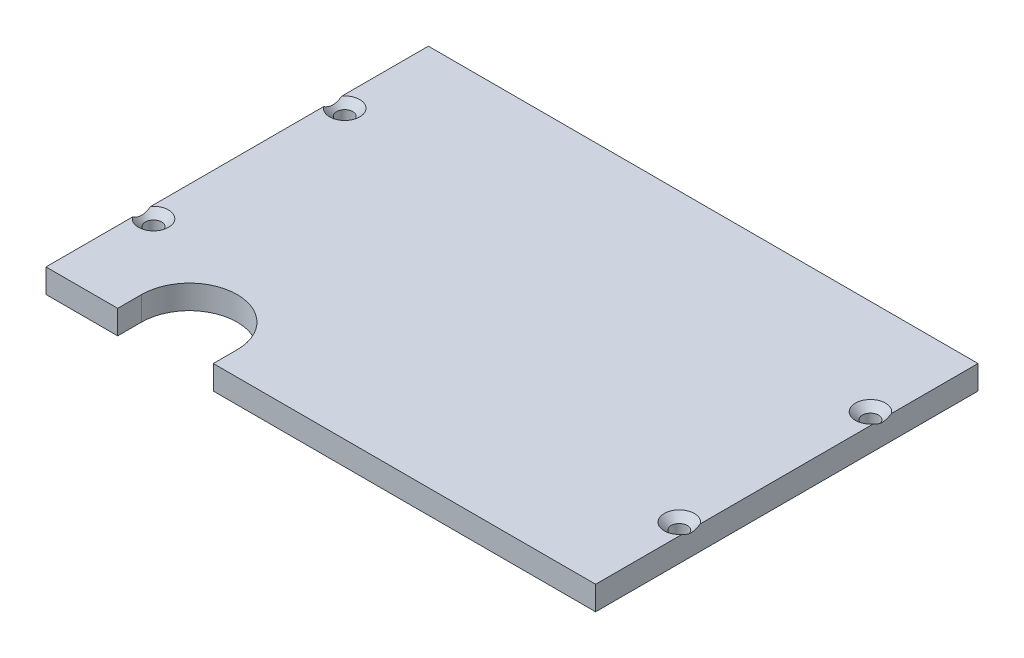
ISO-10303-21;
HEADER;
FILE_DESCRIPTION(('STEP AP214'),'2;1');
FILE_NAME('part.step','',(''),(''),'','','');
FILE_SCHEMA(('AUTOMOTIVE_DESIGN { 1 0 10303 214 1 1 1 1 }'));
ENDSEC;
DATA;
#1=APPLICATION_CONTEXT('core data for automotive mechanical design processes');
#2=APPLICATION_PROTOCOL_DEFINITION('international standard','automotive_design',2000,#1);
#3=PRODUCT_CONTEXT('',#1,'mechanical');
#4=PRODUCT('Part','Part','',(#3));
#5=PRODUCT_RELATED_PRODUCT_CATEGORY('part','',(#4));
#6=PRODUCT_DEFINITION_FORMATION('','',#4);
#7=PRODUCT_DEFINITION_CONTEXT('part definition',#1,'design');
#8=PRODUCT_DEFINITION('design','',#6,#7);
#9=PRODUCT_DEFINITION_SHAPE('','',#8);
#10=(LENGTH_UNIT() NAMED_UNIT(*) SI_UNIT(.MILLI.,.METRE.));
#11=(NAMED_UNIT(*) PLANE_ANGLE_UNIT() SI_UNIT($,.RADIAN.));
#12=(NAMED_UNIT(*) SI_UNIT($,.STERADIAN.) SOLID_ANGLE_UNIT());
#13=UNCERTAINTY_MEASURE_WITH_UNIT(LENGTH_MEASURE(1.E-05),#10,'distance_accuracy_value','');
#14=(GEOMETRIC_REPRESENTATION_CONTEXT(3) GLOBAL_UNCERTAINTY_ASSIGNED_CONTEXT((#13)) GLOBAL_UNIT_ASSIGNED_CONTEXT((#10,
#11,#12)) REPRESENTATION_CONTEXT('',''));
#15=CARTESIAN_POINT('',(0.,0.,0.));
#16=DIRECTION('',(0.,0.,1.));
#17=DIRECTION('',(1.,0.,0.));
#18=AXIS2_PLACEMENT_3D('',#15,#16,#17);
#19=CARTESIAN_POINT('',(0.,-5.,0.));
#20=DIRECTION('',(-1.,0.,0.));
#21=DIRECTION('',(0.,0.,1.));
#22=AXIS2_PLACEMENT_3D('',#19,#20,#21);
#23=PLANE('',#22);
#24=CARTESIAN_POINT('',(0.,2.14470506738386,-64.6673227604892));
#25=CARTESIAN_POINT('',(0.,2.04804038573964,-64.5576455291573));
#26=CARTESIAN_POINT('',(0.,1.95178340767227,-64.4476051730159));
#27=CARTESIAN_POINT('',(0.,1.76030441078791,-64.2266038689229));
#28=CARTESIAN_POINT('',(0.,1.66508252459353,-64.1156428061426));
#29=CARTESIAN_POINT('',(0.,1.47542063978898,-63.8920472480246));
#30=CARTESIAN_POINT('',(0.,1.38098738325443,-63.7794070219388));
#31=CARTESIAN_POINT('',(0.,1.19375450781671,-63.5527852582765));
#32=CARTESIAN_POINT('',(0.,1.10095479472035,-63.4388037986748));
#33=CARTESIAN_POINT('',(0.,0.911300374975574,-63.2014980260879));
#34=CARTESIAN_POINT('',(0.,0.814589313210296,-63.0780585222355));
#35=CARTESIAN_POINT('',(0.,0.624318910573129,-62.8287765439328));
#36=CARTESIAN_POINT('',(0.,0.530759323056346,-62.7029342587456));
#37=CARTESIAN_POINT('',(0.,0.348128832657607,-62.4484184910059));
#38=CARTESIAN_POINT('',(0.,0.259048883672382,-62.3197515355747));
#39=CARTESIAN_POINT('',(0.,0.0869152469271358,-62.0584717595877));
#40=CARTESIAN_POINT('',(0.,0.00385889176521005,-61.9258607227125));
#41=CARTESIAN_POINT('',(0.,-0.128597655752122,-61.6983755764979));
#42=CARTESIAN_POINT('',(0.,-0.180321852516153,-61.6048617608502));
#43=CARTESIAN_POINT('',(0.,-0.278469932148575,-61.4150245683994));
#44=CARTESIAN_POINT('',(0.,-0.324892237393613,-61.3187003659903));
#45=CARTESIAN_POINT('',(0.,-0.410357261039289,-61.1239311978321));
#46=CARTESIAN_POINT('',(0.,-0.449468569164255,-61.0255167193119));
#47=CARTESIAN_POINT('',(0.,-0.518863822314614,-60.8256125361317));
#48=CARTESIAN_POINT('',(0.,-0.549153192881912,-60.724124764148));
#49=CARTESIAN_POINT('',(0.,-0.591533247046322,-60.5484150474986));
#50=CARTESIAN_POINT('',(0.,-0.606354808895325,-60.4748525283882));
#51=CARTESIAN_POINT('',(0.,-0.629797590769258,-60.3267412104027));
#52=CARTESIAN_POINT('',(0.,-0.63841994675027,-60.2521925947731));
#53=CARTESIAN_POINT('',(0.,-0.64899708857063,-60.1027552922653));
#54=CARTESIAN_POINT('',(0.,-0.650964113844461,-60.0278674835375));
#55=CARTESIAN_POINT('',(0.,-0.648153935760052,-59.8782161608349));
#56=CARTESIAN_POINT('',(0.,-0.643376365896324,-59.8034526538357));
#57=CARTESIAN_POINT('',(0.,-0.627381213292676,-59.6549945598021));
#58=CARTESIAN_POINT('',(0.,-0.616194857485032,-59.5812965534887));
#59=CARTESIAN_POINT('',(0.,-0.587961948728264,-59.4350277588885));
#60=CARTESIAN_POINT('',(0.,-0.570913863496585,-59.3624572705294));
#61=CARTESIAN_POINT('',(0.,-0.531614925585797,-59.2184912614131));
#62=CARTESIAN_POINT('',(0.,-0.509346653434911,-59.1471005505784));
#63=CARTESIAN_POINT('',(0.,-0.460406770150915,-59.0058670814294));
#64=CARTESIAN_POINT('',(0.,-0.433735413620173,-58.9360242338768));
#65=CARTESIAN_POINT('',(0.,-0.363010101352297,-58.7646866095353));
#66=CARTESIAN_POINT('',(0.,-0.316759942935124,-58.6641008743433));
#67=CARTESIAN_POINT('',(0.,-0.218125828273922,-58.4659614822295));
#68=CARTESIAN_POINT('',(0.,-0.165738206643062,-58.3684096816775));
#69=CARTESIAN_POINT('',(0.,-0.0561990245488804,-58.1757478680392));
#70=CARTESIAN_POINT('',(0.,0.000963010001086409,-58.0806438558348));
#71=CARTESIAN_POINT('',(0.,0.118841814640728,-57.8927081599856));
#72=CARTESIAN_POINT('',(0.,0.179557858404495,-57.7998760175047));
#73=CARTESIAN_POINT('',(0.,0.304648390446216,-57.6147717264333));
#74=CARTESIAN_POINT('',(0.,0.369062876231045,-57.5225267327214));
#75=CARTESIAN_POINT('',(0.,0.500129477280067,-57.3396411366363));
#76=CARTESIAN_POINT('',(0.,0.566781680204431,-57.2490005973287));
#77=CARTESIAN_POINT('',(0.,0.701771577343232,-57.0691864511182));
#78=CARTESIAN_POINT('',(0.,0.770106766972496,-56.9800109589332));
#79=CARTESIAN_POINT('',(0.,0.908213690897816,-56.8027873124904));
#80=CARTESIAN_POINT('',(0.,0.977985374060587,-56.7147391182858));
#81=CARTESIAN_POINT('',(0.,1.21671326046477,-56.4175603724222));
#82=CARTESIAN_POINT('',(0.,1.3884236269837,-56.2106431555064));
#83=CARTESIAN_POINT('',(0.,1.73615145442411,-55.8004510705346));
#84=CARTESIAN_POINT('',(0.,1.91216942278523,-55.5971766365353));
#85=CARTESIAN_POINT('',(0.,2.26722514821177,-55.193170244573));
#86=CARTESIAN_POINT('',(0.,2.44626386779753,-54.9924391340919));
#87=CARTESIAN_POINT('',(0.,2.80646061614009,-54.5928864589446));
#88=CARTESIAN_POINT('',(0.,2.98761868106823,-54.3940649269755));
#89=CARTESIAN_POINT('',(0.,3.35181816484024,-53.9975172743651));
#90=CARTESIAN_POINT('',(0.,3.53486231447149,-53.7997936648681));
#91=CARTESIAN_POINT('',(0.,3.90215008698826,-53.4054609403436));
#92=CARTESIAN_POINT('',(0.,4.08639372301235,-53.2088518375682));
#93=CARTESIAN_POINT('',(0.,4.64042891389233,-52.620407032647));
#94=CARTESIAN_POINT('',(0.,5.01160082687711,-52.229871498623));
#95=CARTESIAN_POINT('',(0.,5.71402805252223,-51.4952324026565));
#96=CARTESIAN_POINT('',(0.,6.04503321308733,-51.1508889854455));
#97=CARTESIAN_POINT('',(0.,6.70837915693934,-50.4634502173727));
#98=CARTESIAN_POINT('',(0.,7.04072002146205,-50.1203549449151));
#99=CARTESIAN_POINT('',(0.,7.70542483235975,-49.4360589415294));
#100=CARTESIAN_POINT('',(0.,8.03778608943345,-49.0948555960584));
#101=CARTESIAN_POINT('',(0.,8.70322099771822,-48.4131901175498));
#102=CARTESIAN_POINT('',(0.,9.03629459818936,-48.0727279349908));
#103=CARTESIAN_POINT('',(0.,9.3696270386106,-47.7325201778886));
#104=B_SPLINE_CURVE_WITH_KNOTS('',3,(#24,#25,#26,#27,#28,#29,#30,#31,#32,#33,#34,#35,#36,#37,
#38,#39,#40,#41,#42,#43,#44,#45,#46,#47,#48,#49,#50,#51,#52,#53,#54,#55,#56,#57,#58,#59,#60,#61,
#62,#63,#64,#65,#66,#67,#68,#69,#70,#71,#72,#73,#74,#75,#76,#77,#78,#79,#80,#81,#82,#83,#84,#85,
#86,#87,#88,#89,#90,#91,#92,#93,#94,#95,#96,#97,#98,#99,#100,#101,#102,#103),.UNSPECIFIED.,.F.,
.F.,(4,2,2,2,2,2,2,2,2,2,2,2,2,2,2,2,2,2,2,2,2,2,2,2,2,2,2,2,2,2,2,2,2,2,2,2,2,2,2,4),(0.,
0.438590046589923,0.877235641036946,1.31818722879923,1.75911330661538,2.22951563461658,
2.69988106141641,3.16925499196792,3.63841978626333,3.95889023477053,4.27945579492674,
4.59684370347591,4.91403600247658,5.13892838196225,5.36377954116467,5.58821696416134,
5.81266658369639,6.0360317580985,6.25945536561297,6.48363541332445,6.70780250266699,
7.03963419919012,7.37166509071615,7.7044445503452,8.03715623633875,8.37464261768403,
8.71214223515848,9.04916678328737,9.38617935539358,10.1927264699041,10.9993690581913,
11.806273716728,12.613192167031,13.4215160892333,14.2298488803591,15.846178176558,
17.2790848381215,18.7120800073948,20.1410482748921,21.5699179391234),.UNSPECIFIED.);
#105=CARTESIAN_POINT('',(0.,0.,-61.9163767896737));
#106=VERTEX_POINT('',#105);
#107=CARTESIAN_POINT('',(0.,0.,-58.0836232103263));
#108=VERTEX_POINT('',#107);
#109=EDGE_CURVE('E11',#106,#108,#104,.T.);
#110=ORIENTED_EDGE('',*,*,#109,.F.);
#111=DIRECTION('',(0.,0.,1.));
#112=VECTOR('',#111,1.);
#113=CARTESIAN_POINT('',(0.,0.,0.));
#114=LINE('',#113,#112);
#115=CARTESIAN_POINT('',(0.,0.,-80.));
#116=VERTEX_POINT('',#115);
#117=EDGE_CURVE('E139',#116,#106,#114,.T.);
#118=ORIENTED_EDGE('',*,*,#117,.F.);
#119=DIRECTION('',(0.,1.,0.));
#120=VECTOR('',#119,1.);
#121=CARTESIAN_POINT('',(0.,-5.,-80.));
#122=LINE('',#121,#120);
#123=CARTESIAN_POINT('',(0.,-5.,-80.));
#124=VERTEX_POINT('',#123);
#125=EDGE_CURVE('E187',#124,#116,#122,.T.);
#126=ORIENTED_EDGE('',*,*,#125,.F.);
#127=DIRECTION('',(0.,0.,1.));
#128=VECTOR('',#127,1.);
#129=CARTESIAN_POINT('',(0.,-5.,0.));
#130=LINE('',#129,#128);
#131=CARTESIAN_POINT('',(0.,-5.,0.));
#132=VERTEX_POINT('',#131);
#133=EDGE_CURVE('E186',#124,#132,#130,.T.);
#134=ORIENTED_EDGE('',*,*,#133,.T.);
#135=DIRECTION('',(0.,1.,0.));
#136=VECTOR('',#135,1.);
#137=CARTESIAN_POINT('',(0.,-5.,0.));
#138=LINE('',#137,#136);
#139=CARTESIAN_POINT('',(0.,0.,0.));
#140=VERTEX_POINT('',#139);
#141=EDGE_CURVE('E210',#132,#140,#138,.T.);
#142=ORIENTED_EDGE('',*,*,#141,.T.);
#143=CARTESIAN_POINT('',(0.,0.,-18.0836232103263));
#144=VERTEX_POINT('',#143);
#145=EDGE_CURVE('E146',#144,#140,#114,.T.);
#146=ORIENTED_EDGE('',*,*,#145,.F.);
#147=CARTESIAN_POINT('',(0.,2.14470506738386,-24.6673227604892));
#148=CARTESIAN_POINT('',(0.,2.04804038573963,-24.5576455291573));
#149=CARTESIAN_POINT('',(0.,1.95178340767226,-24.4476051730159));
#150=CARTESIAN_POINT('',(0.,1.76030441078791,-24.2266038689229));
#151=CARTESIAN_POINT('',(0.,1.66508252459353,-24.1156428061426));
#152=CARTESIAN_POINT('',(0.,1.47542063978898,-23.8920472480246));
#153=CARTESIAN_POINT('',(0.,1.38098738325442,-23.7794070219388));
#154=CARTESIAN_POINT('',(0.,1.19375450781671,-23.5527852582765));
#155=CARTESIAN_POINT('',(0.,1.10095479472035,-23.4388037986748));
#156=CARTESIAN_POINT('',(0.,0.911300374975571,-23.2014980260879));
#157=CARTESIAN_POINT('',(0.,0.814589313210293,-23.0780585222355));
#158=CARTESIAN_POINT('',(0.,0.624318910573126,-22.8287765439328));
#159=CARTESIAN_POINT('',(0.,0.530759323056341,-22.7029342587456));
#160=CARTESIAN_POINT('',(0.,0.348128832657599,-22.4484184910059));
#161=CARTESIAN_POINT('',(0.,0.259048883672373,-22.3197515355747));
#162=CARTESIAN_POINT('',(0.,0.08691524692713,-22.0584717595877));
#163=CARTESIAN_POINT('',(0.,0.00385889176520677,-21.9258607227125));
#164=CARTESIAN_POINT('',(0.,-0.128597655752126,-21.6983755764979));
#165=CARTESIAN_POINT('',(0.,-0.18032185251616,-21.6048617608502));
#166=CARTESIAN_POINT('',(0.,-0.278469932148583,-21.4150245683994));
#167=CARTESIAN_POINT('',(0.,-0.324892237393621,-21.3187003659903));
#168=CARTESIAN_POINT('',(0.,-0.410357261039295,-21.1239311978321));
#169=CARTESIAN_POINT('',(0.,-0.44946856916426,-21.0255167193119));
#170=CARTESIAN_POINT('',(0.,-0.518863822314618,-20.8256125361317));
#171=CARTESIAN_POINT('',(0.,-0.549153192881915,-20.724124764148));
#172=CARTESIAN_POINT('',(0.,-0.591533247046322,-20.5484150474986));
#173=CARTESIAN_POINT('',(0.,-0.606354808895325,-20.4748525283882));
#174=CARTESIAN_POINT('',(0.,-0.629797590769258,-20.3267412104027));
#175=CARTESIAN_POINT('',(0.,-0.63841994675027,-20.2521925947731));
#176=CARTESIAN_POINT('',(0.,-0.64899708857063,-20.1027552922653));
#177=CARTESIAN_POINT('',(0.,-0.650964113844462,-20.0278674835375));
#178=CARTESIAN_POINT('',(0.,-0.648153935760052,-19.8782161608349));
#179=CARTESIAN_POINT('',(0.,-0.643376365896324,-19.8034526538357));
#180=CARTESIAN_POINT('',(0.,-0.627381213292676,-19.6549945598021));
#181=CARTESIAN_POINT('',(0.,-0.616194857485033,-19.5812965534887));
#182=CARTESIAN_POINT('',(0.,-0.587961948728264,-19.4350277588885));
#183=CARTESIAN_POINT('',(0.,-0.570913863496584,-19.3624572705294));
#184=CARTESIAN_POINT('',(0.,-0.531614925585793,-19.2184912614131));
#185=CARTESIAN_POINT('',(0.,-0.509346653434907,-19.1471005505783));
#186=CARTESIAN_POINT('',(0.,-0.460406770150912,-19.0058670814294));
#187=CARTESIAN_POINT('',(0.,-0.433735413620169,-18.9360242338768));
#188=CARTESIAN_POINT('',(0.,-0.363010101352291,-18.7646866095353));
#189=CARTESIAN_POINT('',(0.,-0.316759942935113,-18.6641008743432));
#190=CARTESIAN_POINT('',(0.,-0.218125828273906,-18.4659614822295));
#191=CARTESIAN_POINT('',(0.,-0.165738206643045,-18.3684096816775));
#192=CARTESIAN_POINT('',(0.,-0.0561990245488614,-18.1757478680392));
#193=CARTESIAN_POINT('',(0.,0.00096301000110724,-18.0806438558347));
#194=CARTESIAN_POINT('',(0.,0.11884181464075,-17.8927081599856));
#195=CARTESIAN_POINT('',(0.,0.179557858404516,-17.7998760175046));
#196=CARTESIAN_POINT('',(0.,0.304648390446239,-17.6147717264333));
#197=CARTESIAN_POINT('',(0.,0.369062876231071,-17.5225267327214));
#198=CARTESIAN_POINT('',(0.,0.500129477280097,-17.3396411366362));
#199=CARTESIAN_POINT('',(0.,0.566781680204464,-17.2490005973286));
#200=CARTESIAN_POINT('',(0.,0.701771577343267,-17.0691864511181));
#201=CARTESIAN_POINT('',(0.,0.770106766972531,-16.9800109589331));
#202=CARTESIAN_POINT('',(0.,0.908213690897854,-16.8027873124904));
#203=CARTESIAN_POINT('',(0.,0.977985374060626,-16.7147391182857));
#204=CARTESIAN_POINT('',(0.,1.21671326046481,-16.4175603724221));
#205=CARTESIAN_POINT('',(0.,1.38842362698374,-16.2106431555064));
#206=CARTESIAN_POINT('',(0.,1.73615145442415,-15.8004510705345));
#207=CARTESIAN_POINT('',(0.,1.91216942278527,-15.5971766365353));
#208=CARTESIAN_POINT('',(0.,2.26722514821181,-15.193170244573));
#209=CARTESIAN_POINT('',(0.,2.44626386779757,-14.9924391340918));
#210=CARTESIAN_POINT('',(0.,2.80646061614013,-14.5928864589446));
#211=CARTESIAN_POINT('',(0.,2.98761868106826,-14.3940649269755));
#212=CARTESIAN_POINT('',(0.,3.35181816484027,-13.9975172743651));
#213=CARTESIAN_POINT('',(0.,3.53486231447153,-13.7997936648681));
#214=CARTESIAN_POINT('',(0.,3.9021500869883,-13.4054609403436));
#215=CARTESIAN_POINT('',(0.,4.08639372301239,-13.2088518375682));
#216=CARTESIAN_POINT('',(0.,4.64042891389237,-12.620407032647));
#217=CARTESIAN_POINT('',(0.,5.01160082687715,-12.2298714986229));
#218=CARTESIAN_POINT('',(0.,5.71402805252227,-11.4952324026565));
#219=CARTESIAN_POINT('',(0.,6.04503321308737,-11.1508889854455));
#220=CARTESIAN_POINT('',(0.,6.70837915693938,-10.4634502173726));
#221=CARTESIAN_POINT('',(0.,7.04072002146209,-10.1203549449151));
#222=CARTESIAN_POINT('',(0.,7.70542483235978,-9.43605894152936));
#223=CARTESIAN_POINT('',(0.,8.03778608943349,-9.0948555960584));
#224=CARTESIAN_POINT('',(0.,8.70322099771826,-8.41319011754976));
#225=CARTESIAN_POINT('',(0.,9.0362945981894,-8.07272793499074));
#226=CARTESIAN_POINT('',(0.,9.36962703861063,-7.73252017788857));
#227=B_SPLINE_CURVE_WITH_KNOTS('',3,(#147,#148,#149,#150,#151,#152,#153,#154,#155,#156,#157,
#158,#159,#160,#161,#162,#163,#164,#165,#166,#167,#168,#169,#170,#171,#172,#173,#174,#175,#176,
#177,#178,#179,#180,#181,#182,#183,#184,#185,#186,#187,#188,#189,#190,#191,#192,#193,#194,#195,
#196,#197,#198,#199,#200,#201,#202,#203,#204,#205,#206,#207,#208,#209,#210,#211,#212,#213,#214,
#215,#216,#217,#218,#219,#220,#221,#222,#223,#224,#225,#226),.UNSPECIFIED.,.F.,.F.,(4,2,2,2,2,2,
2,2,2,2,2,2,2,2,2,2,2,2,2,2,2,2,2,2,2,2,2,2,2,2,2,2,2,2,2,2,2,2,2,4),(0.,0.43859004658992,
0.877235641036942,1.31818722879922,1.75911330661537,2.22951563461657,2.69988106141641,
3.16925499196792,3.63841978626332,3.95889023477053,4.27945579492675,4.5968437034759,
4.91403600247657,5.13892838196224,5.36377954116465,5.58821696416133,5.81266658369638,
6.03603175809848,6.25945536561296,6.48363541332445,6.70780250266699,7.03963419919014,
7.37166509071618,7.70444455034523,8.03715623633878,8.37464261768407,8.71214223515852,
9.04916678328742,9.38617935539363,10.1927264699041,10.9993690581914,11.8062737167281,
12.613192167031,13.4215160892334,14.2298488803592,15.8461781765581,17.2790848381216,
18.7120800073948,20.1410482748922,21.5699179391234),.UNSPECIFIED.);
#228=CARTESIAN_POINT('',(0.,0.,-21.9163767896737));
#229=VERTEX_POINT('',#228);
#230=EDGE_CURVE('E54',#229,#144,#227,.T.);
#231=ORIENTED_EDGE('',*,*,#230,.F.);
#232=EDGE_CURVE('E66',#108,#229,#114,.T.);
#233=ORIENTED_EDGE('',*,*,#232,.F.);
#234=EDGE_LOOP('',(#110,#118,#126,#134,#142,#146,#231,#233));
#235=FACE_BOUND('',#234,.T.);
#236=ADVANCED_FACE('F40',(#235),#23,.T.);
#237=CARTESIAN_POINT('',(0.,-5.,-80.));
#238=DIRECTION('',(0.,0.,-1.));
#239=DIRECTION('',(-1.,0.,0.));
#240=AXIS2_PLACEMENT_3D('',#237,#238,#239);
#241=PLANE('',#240);
#242=DIRECTION('',(-1.,0.,0.));
#243=VECTOR('',#242,1.);
#244=CARTESIAN_POINT('',(0.,0.,-80.));
#245=LINE('',#244,#243);
#246=CARTESIAN_POINT('',(115.,0.,-80.));
#247=VERTEX_POINT('',#246);
#248=EDGE_CURVE('E182',#247,#116,#245,.T.);
#249=ORIENTED_EDGE('',*,*,#248,.F.);
#250=DIRECTION('',(0.,1.,0.));
#251=VECTOR('',#250,1.);
#252=CARTESIAN_POINT('',(115.,-5.,-80.));
#253=LINE('',#252,#251);
#254=CARTESIAN_POINT('',(115.,-5.,-80.));
#255=VERTEX_POINT('',#254);
#256=EDGE_CURVE('E191',#255,#247,#253,.T.);
#257=ORIENTED_EDGE('',*,*,#256,.F.);
#258=DIRECTION('',(-1.,0.,0.));
#259=VECTOR('',#258,1.);
#260=CARTESIAN_POINT('',(0.,-5.,-80.));
#261=LINE('',#260,#259);
#262=EDGE_CURVE('E156',#255,#124,#261,.T.);
#263=ORIENTED_EDGE('',*,*,#262,.T.);
#264=ORIENTED_EDGE('',*,*,#125,.T.);
#265=EDGE_LOOP('',(#249,#257,#263,#264));
#266=FACE_BOUND('',#265,.T.);
#267=ADVANCED_FACE('F238',(#266),#241,.T.);
#268=CARTESIAN_POINT('',(115.,-5.,0.));
#269=DIRECTION('',(1.,0.,0.));
#270=DIRECTION('',(0.,0.,-1.));
#271=AXIS2_PLACEMENT_3D('',#268,#269,#270);
#272=PLANE('',#271);
#273=CARTESIAN_POINT('',(115.,2.14470505004971,-64.667322740825));
#274=CARTESIAN_POINT('',(115.,2.04804036895066,-64.5576455100086));
#275=CARTESIAN_POINT('',(115.,1.95178339142903,-64.4476051543825));
#276=CARTESIAN_POINT('',(115.,1.76030439563719,-64.2266038513203));
#277=CARTESIAN_POINT('',(115.,1.66508250998959,-64.1156427890554));
#278=CARTESIAN_POINT('',(115.,1.47542062628258,-63.8920472319717));
#279=CARTESIAN_POINT('',(115.,1.38098737029878,-63.7794070064048));
#280=CARTESIAN_POINT('',(115.,1.19375449596302,-63.5527852437818));
#281=CARTESIAN_POINT('',(115.,1.10095478341784,-63.4388037847003));
#282=CARTESIAN_POINT('',(115.,0.911300364928831,-63.2014980133376));
#283=CARTESIAN_POINT('',(115.,0.814589303865295,-63.0780585101917));
#284=CARTESIAN_POINT('',(115.,0.624318902620645,-62.8287765333141));
#285=CARTESIAN_POINT('',(115.,0.530759315794639,-62.7029342488456));
#286=CARTESIAN_POINT('',(115.,0.348128826755643,-62.4484184825611));
#287=CARTESIAN_POINT('',(115.,0.259048878439442,-62.3197515278664));
#288=CARTESIAN_POINT('',(115.,0.0869152429950619,-62.0584717533839));
#289=CARTESIAN_POINT('',(115.,0.00385888846500719,-61.9258607172765));
#290=CARTESIAN_POINT('',(115.,-0.128597657941284,-61.6983755725804));
#291=CARTESIAN_POINT('',(115.,-0.18032185421543,-61.6048617576746));
#292=CARTESIAN_POINT('',(115.,-0.278469932943076,-61.4150245667515));
#293=CARTESIAN_POINT('',(115.,-0.324892237773282,-61.3187003651283));
#294=CARTESIAN_POINT('',(115.,-0.410357260718966,-61.1239311985589));
#295=CARTESIAN_POINT('',(115.,-0.449468568555769,-61.0255167208401));
#296=CARTESIAN_POINT('',(115.,-0.518863821288738,-60.8256125393108));
#297=CARTESIAN_POINT('',(115.,-0.549153191726495,-60.7241247681764));
#298=CARTESIAN_POINT('',(115.,-0.591533245979603,-60.5484150524618));
#299=CARTESIAN_POINT('',(115.,-0.606354807953601,-60.4748525334193));
#300=CARTESIAN_POINT('',(115.,-0.629797590098025,-60.3267412155609));
#301=CARTESIAN_POINT('',(115.,-0.638419946224522,-60.2521925999904));
#302=CARTESIAN_POINT('',(115.,-0.648997088349826,-60.1027552975908));
#303=CARTESIAN_POINT('',(115.,-0.650964113783383,-60.0278674889122));
#304=CARTESIAN_POINT('',(115.,-0.648153936024573,-59.8782161662931));
#305=CARTESIAN_POINT('',(115.,-0.643376366326736,-59.8034526593284));
#306=CARTESIAN_POINT('',(115.,-0.627381214049792,-59.6549945653377));
#307=CARTESIAN_POINT('',(115.,-0.61619485840195,-59.5812965590329));
#308=CARTESIAN_POINT('',(115.,-0.587961949953202,-59.4350277644399));
#309=CARTESIAN_POINT('',(115.,-0.570913864869746,-59.3624572760795));
#310=CARTESIAN_POINT('',(115.,-0.531614927240823,-59.2184912669541));
#311=CARTESIAN_POINT('',(115.,-0.509346655223516,-59.1471005561117));
#312=CARTESIAN_POINT('',(115.,-0.460406772190888,-59.0058670869447));
#313=CARTESIAN_POINT('',(115.,-0.433735415777921,-58.9360242393817));
#314=CARTESIAN_POINT('',(115.,-0.363010104062583,-58.7646866156896));
#315=CARTESIAN_POINT('',(115.,-0.316759946124725,-58.6641008811356));
#316=CARTESIAN_POINT('',(115.,-0.218125832465461,-58.4659614902644));
#317=CARTESIAN_POINT('',(115.,-0.165738211357284,-58.3684096903172));
#318=CARTESIAN_POINT('',(115.,-0.0561990303350822,-58.1757478778675));
#319=CARTESIAN_POINT('',(115.,0.000963003665454541,-58.080643866247));
#320=CARTESIAN_POINT('',(115.,0.118841807192747,-57.892708171549));
#321=CARTESIAN_POINT('',(115.,0.179557850393608,-57.7998760296354));
#322=CARTESIAN_POINT('',(115.,0.304648381295905,-57.6147717396932));
#323=CARTESIAN_POINT('',(115.,0.369062866504198,-57.522526746543));
#324=CARTESIAN_POINT('',(115.,0.500129466396325,-57.3396411515742));
#325=CARTESIAN_POINT('',(115.,0.56678166874033,-57.2490006128213));
#326=CARTESIAN_POINT('',(115.,0.701771564718353,-57.0691864677137));
#327=CARTESIAN_POINT('',(115.,0.770106753767222,-56.9800109760771));
#328=CARTESIAN_POINT('',(115.,0.90821367653142,-56.8027873307283));
#329=CARTESIAN_POINT('',(115.,0.977985359113463,-56.7147391370692));
#330=CARTESIAN_POINT('',(115.,1.21671324484334,-56.4175603914407));
#331=CARTESIAN_POINT('',(115.,1.38842361132044,-56.2106431742515));
#332=CARTESIAN_POINT('',(115.,1.73615143873473,-55.8004510887765));
#333=CARTESIAN_POINT('',(115.,1.91216940711159,-55.5971766545476));
#334=CARTESIAN_POINT('',(115.,2.26722513260598,-55.1931702621527));
#335=CARTESIAN_POINT('',(115.,2.44626385224389,-54.9924391514686));
#336=CARTESIAN_POINT('',(115.,2.80646060071293,-54.5928864759342));
#337=CARTESIAN_POINT('',(115.,2.98761866571537,-54.3940649437808));
#338=CARTESIAN_POINT('',(115.,3.35181814965513,-53.99751729081));
#339=CARTESIAN_POINT('',(115.,3.53486229937988,-53.7997936811368));
#340=CARTESIAN_POINT('',(115.,3.90215007209396,-53.4054609562691));
#341=CARTESIAN_POINT('',(115.,4.08639370822186,-53.2088518533266));
#342=CARTESIAN_POINT('',(115.,4.64042889942191,-52.6204070479163));
#343=CARTESIAN_POINT('',(115.,5.01160081263362,-52.2298715135799));
#344=CARTESIAN_POINT('',(115.,5.71402803827876,-51.4952324175005));
#345=CARTESIAN_POINT('',(115.,6.04503319861284,-51.150889000485));
#346=CARTESIAN_POINT('',(115.,6.70837914200805,-50.463450232807));
#347=CARTESIAN_POINT('',(115.,7.040720006305,-50.1203549605489));
#348=CARTESIAN_POINT('',(115.,7.70542481674034,-49.4360589575793));
#349=CARTESIAN_POINT('',(115.,8.0377860735774,-49.0948556123251));
#350=CARTESIAN_POINT('',(115.,8.70322098139055,-48.4131901342526));
#351=CARTESIAN_POINT('',(115.,9.03629458162669,-48.072727951913));
#352=CARTESIAN_POINT('',(115.,9.36962702181362,-47.7325201950309));
#353=B_SPLINE_CURVE_WITH_KNOTS('',3,(#273,#274,#275,#276,#277,#278,#279,#280,#281,#282,#283,
#284,#285,#286,#287,#288,#289,#290,#291,#292,#293,#294,#295,#296,#297,#298,#299,#300,#301,#302,
#303,#304,#305,#306,#307,#308,#309,#310,#311,#312,#313,#314,#315,#316,#317,#318,#319,#320,#321,
#322,#323,#324,#325,#326,#327,#328,#329,#330,#331,#332,#333,#334,#335,#336,#337,#338,#339,#340,
#341,#342,#343,#344,#345,#346,#347,#348,#349,#350,#351,#352),.UNSPECIFIED.,.F.,.F.,(4,2,2,2,2,2,
2,2,2,2,2,2,2,2,2,2,2,2,2,2,2,2,2,2,2,2,2,2,2,2,2,2,2,2,2,2,2,2,2,4),(0.,0.43859004434833,
0.877235636553653,1.31818722206134,1.75911329762308,2.22951562265762,2.69988104649101,
3.16925497408391,3.63841976542307,3.9588902112738,4.2794557687706,4.59684367477397,
4.91403597123821,5.13892835059914,5.36377950967706,5.58821693253956,5.8126665519399,
6.0360317262437,6.25945533365954,6.48363538127267,6.7078024705175,7.03963416470471,
7.37166505389153,7.70444451117052,8.03715619481537,8.37464257378883,8.71214218889119,
9.04916673465518,9.38617930439645,10.1927264194551,10.9993690082934,11.8062736673881,
12.6131921182495,13.4215160410302,14.2298488327345,15.8461781300815,17.2790847907418,
18.7120799591142,20.1410482256504,21.5699178889181),.UNSPECIFIED.);
#354=CARTESIAN_POINT('',(115.,0.,-58.0836232103263));
#355=VERTEX_POINT('',#354);
#356=CARTESIAN_POINT('',(115.,0.,-61.9163767896737));
#357=VERTEX_POINT('',#356);
#358=EDGE_CURVE('E222',#355,#357,#353,.F.);
#359=ORIENTED_EDGE('',*,*,#358,.F.);
#360=DIRECTION('',(0.,0.,-1.));
#361=VECTOR('',#360,1.);
#362=CARTESIAN_POINT('',(115.,0.,0.));
#363=LINE('',#362,#361);
#364=CARTESIAN_POINT('',(115.,0.,-21.9163767896737));
#365=VERTEX_POINT('',#364);
#366=EDGE_CURVE('E183',#365,#355,#363,.T.);
#367=ORIENTED_EDGE('',*,*,#366,.F.);
#368=CARTESIAN_POINT('',(115.,2.14470505004971,-24.667322740825));
#369=CARTESIAN_POINT('',(115.,2.04804036895066,-24.5576455100086));
#370=CARTESIAN_POINT('',(115.,1.95178339142903,-24.4476051543825));
#371=CARTESIAN_POINT('',(115.,1.76030439563719,-24.2266038513203));
#372=CARTESIAN_POINT('',(115.,1.66508250998959,-24.1156427890554));
#373=CARTESIAN_POINT('',(115.,1.47542062628258,-23.8920472319717));
#374=CARTESIAN_POINT('',(115.,1.38098737029878,-23.7794070064048));
#375=CARTESIAN_POINT('',(115.,1.19375449596302,-23.5527852437818));
#376=CARTESIAN_POINT('',(115.,1.10095478341785,-23.4388037847003));
#377=CARTESIAN_POINT('',(115.,0.911300364928841,-23.2014980133376));
#378=CARTESIAN_POINT('',(115.,0.814589303865302,-23.0780585101917));
#379=CARTESIAN_POINT('',(115.,0.624318902620651,-22.8287765333141));
#380=CARTESIAN_POINT('',(115.,0.530759315794646,-22.7029342488456));
#381=CARTESIAN_POINT('',(115.,0.348128826755649,-22.4484184825611));
#382=CARTESIAN_POINT('',(115.,0.259048878439446,-22.3197515278664));
#383=CARTESIAN_POINT('',(115.,0.0869152429950641,-22.0584717533839));
#384=CARTESIAN_POINT('',(115.,0.00385888846500909,-21.9258607172765));
#385=CARTESIAN_POINT('',(115.,-0.128597657941284,-21.6983755725804));
#386=CARTESIAN_POINT('',(115.,-0.18032185421543,-21.6048617576746));
#387=CARTESIAN_POINT('',(115.,-0.278469932943076,-21.4150245667515));
#388=CARTESIAN_POINT('',(115.,-0.324892237773281,-21.3187003651283));
#389=CARTESIAN_POINT('',(115.,-0.410357260718965,-21.1239311985589));
#390=CARTESIAN_POINT('',(115.,-0.449468568555769,-21.0255167208401));
#391=CARTESIAN_POINT('',(115.,-0.51886382128874,-20.8256125393108));
#392=CARTESIAN_POINT('',(115.,-0.549153191726498,-20.7241247681764));
#393=CARTESIAN_POINT('',(115.,-0.591533245979606,-20.5484150524618));
#394=CARTESIAN_POINT('',(115.,-0.606354807953603,-20.4748525334193));
#395=CARTESIAN_POINT('',(115.,-0.629797590098026,-20.3267412155609));
#396=CARTESIAN_POINT('',(115.,-0.638419946224523,-20.2521925999904));
#397=CARTESIAN_POINT('',(115.,-0.648997088349827,-20.1027552975908));
#398=CARTESIAN_POINT('',(115.,-0.650964113783383,-20.0278674889122));
#399=CARTESIAN_POINT('',(115.,-0.648153936024572,-19.8782161662931));
#400=CARTESIAN_POINT('',(115.,-0.643376366326736,-19.8034526593284));
#401=CARTESIAN_POINT('',(115.,-0.627381214049791,-19.6549945653377));
#402=CARTESIAN_POINT('',(115.,-0.616194858401949,-19.5812965590329));
#403=CARTESIAN_POINT('',(115.,-0.587961949953199,-19.4350277644399));
#404=CARTESIAN_POINT('',(115.,-0.570913864869743,-19.3624572760795));
#405=CARTESIAN_POINT('',(115.,-0.531614927240819,-19.2184912669541));
#406=CARTESIAN_POINT('',(115.,-0.509346655223511,-19.1471005561117));
#407=CARTESIAN_POINT('',(115.,-0.460406772190882,-19.0058670869447));
#408=CARTESIAN_POINT('',(115.,-0.433735415777916,-18.9360242393817));
#409=CARTESIAN_POINT('',(115.,-0.363010104062578,-18.7646866156896));
#410=CARTESIAN_POINT('',(115.,-0.316759946124718,-18.6641008811355));
#411=CARTESIAN_POINT('',(115.,-0.218125832465451,-18.4659614902644));
#412=CARTESIAN_POINT('',(115.,-0.165738211357273,-18.3684096903171));
#413=CARTESIAN_POINT('',(115.,-0.0561990303350684,-18.1757478778675));
#414=CARTESIAN_POINT('',(115.,0.000963003665469835,-18.080643866247));
#415=CARTESIAN_POINT('',(115.,0.118841807192765,-17.892708171549));
#416=CARTESIAN_POINT('',(115.,0.179557850393627,-17.7998760296354));
#417=CARTESIAN_POINT('',(115.,0.304648381295926,-17.6147717396932));
#418=CARTESIAN_POINT('',(115.,0.36906286650422,-17.522526746543));
#419=CARTESIAN_POINT('',(115.,0.500129466396352,-17.3396411515741));
#420=CARTESIAN_POINT('',(115.,0.566781668740359,-17.2490006128212));
#421=CARTESIAN_POINT('',(115.,0.701771564718386,-17.0691864677137));
#422=CARTESIAN_POINT('',(115.,0.770106753767256,-16.980010976077));
#423=CARTESIAN_POINT('',(115.,0.908213676531458,-16.8027873307282));
#424=CARTESIAN_POINT('',(115.,0.977985359113505,-16.7147391370692));
#425=CARTESIAN_POINT('',(115.,1.21671324484339,-16.4175603914406));
#426=CARTESIAN_POINT('',(115.,1.38842361132048,-16.2106431742514));
#427=CARTESIAN_POINT('',(115.,1.73615143873477,-15.8004510887764));
#428=CARTESIAN_POINT('',(115.,1.91216940711163,-15.5971766545475));
#429=CARTESIAN_POINT('',(115.,2.26722513260603,-15.1931702621527));
#430=CARTESIAN_POINT('',(115.,2.44626385224394,-14.9924391514685));
#431=CARTESIAN_POINT('',(115.,2.80646060071297,-14.5928864759341));
#432=CARTESIAN_POINT('',(115.,2.98761866571541,-14.3940649437808));
#433=CARTESIAN_POINT('',(115.,3.35181814965517,-13.99751729081));
#434=CARTESIAN_POINT('',(115.,3.53486229937993,-13.7997936811368));
#435=CARTESIAN_POINT('',(115.,3.902150072094,-13.4054609562691));
#436=CARTESIAN_POINT('',(115.,4.08639370822191,-13.2088518533266));
#437=CARTESIAN_POINT('',(115.,4.64042889942195,-12.6204070479163));
#438=CARTESIAN_POINT('',(115.,5.01160081263367,-12.2298715135798));
#439=CARTESIAN_POINT('',(115.,5.7140280382788,-11.4952324175005));
#440=CARTESIAN_POINT('',(115.,6.04503319861288,-11.1508890004849));
#441=CARTESIAN_POINT('',(115.,6.70837914200809,-10.463450232807));
#442=CARTESIAN_POINT('',(115.,7.04072000630504,-10.1203549605488));
#443=CARTESIAN_POINT('',(115.,7.70542481674038,-9.43605895757925));
#444=CARTESIAN_POINT('',(115.,8.03778607357745,-9.09485561232504));
#445=CARTESIAN_POINT('',(115.,8.70322098139059,-8.41319013425254));
#446=CARTESIAN_POINT('',(115.,9.03629458162674,-8.07272795191292));
#447=CARTESIAN_POINT('',(115.,9.36962702181367,-7.73252019503082));
#448=B_SPLINE_CURVE_WITH_KNOTS('',3,(#368,#369,#370,#371,#372,#373,#374,#375,#376,#377,#378,
#379,#380,#381,#382,#383,#384,#385,#386,#387,#388,#389,#390,#391,#392,#393,#394,#395,#396,#397,
#398,#399,#400,#401,#402,#403,#404,#405,#406,#407,#408,#409,#410,#411,#412,#413,#414,#415,#416,
#417,#418,#419,#420,#421,#422,#423,#424,#425,#426,#427,#428,#429,#430,#431,#432,#433,#434,#435,
#436,#437,#438,#439,#440,#441,#442,#443,#444,#445,#446,#447),.UNSPECIFIED.,.F.,.F.,(4,2,2,2,2,2,
2,2,2,2,2,2,2,2,2,2,2,2,2,2,2,2,2,2,2,2,2,2,2,2,2,2,2,2,2,2,2,2,2,4),(0.,0.438590044348321,
0.877235636553656,1.31818722206133,1.75911329762307,2.22951562265761,2.69988104649099,
3.16925497408391,3.63841976542308,3.9588902112738,4.2794557687706,4.59684367477398,
4.91403597123822,5.13892835059916,5.36377950967707,5.58821693253957,5.81266655193992,
6.03603172624372,6.25945533365956,6.48363538127269,6.70780247051752,7.03963416470474,
7.37166505389156,7.70444451117056,8.0371561948154,8.37464257378888,8.71214218889124,
9.04916673465524,9.38617930439652,10.1927264194552,10.9993690082934,11.8062736673882,
12.6131921182496,13.4215160410302,14.2298488327346,15.8461781300815,17.2790847907419,
18.7120799591142,20.1410482256505,21.5699178889182),.UNSPECIFIED.);
#449=CARTESIAN_POINT('',(115.,0.,-18.0836232103263));
#450=VERTEX_POINT('',#449);
#451=EDGE_CURVE('E190',#450,#365,#448,.F.);
#452=ORIENTED_EDGE('',*,*,#451,.F.);
#453=CARTESIAN_POINT('',(115.,0.,0.));
#454=VERTEX_POINT('',#453);
#455=EDGE_CURVE('E178',#454,#450,#363,.T.);
#456=ORIENTED_EDGE('',*,*,#455,.F.);
#457=DIRECTION('',(0.,1.,0.));
#458=VECTOR('',#457,1.);
#459=CARTESIAN_POINT('',(115.,-5.,0.));
#460=LINE('',#459,#458);
#461=CARTESIAN_POINT('',(115.,-5.,0.));
#462=VERTEX_POINT('',#461);
#463=EDGE_CURVE('E195',#462,#454,#460,.T.);
#464=ORIENTED_EDGE('',*,*,#463,.F.);
#465=DIRECTION('',(0.,0.,-1.));
#466=VECTOR('',#465,1.);
#467=CARTESIAN_POINT('',(115.,-5.,0.));
#468=LINE('',#467,#466);
#469=EDGE_CURVE('E283',#462,#255,#468,.T.);
#470=ORIENTED_EDGE('',*,*,#469,.T.);
#471=ORIENTED_EDGE('',*,*,#256,.T.);
#472=EDGE_CURVE('E177',#357,#247,#363,.T.);
#473=ORIENTED_EDGE('',*,*,#472,.F.);
#474=EDGE_LOOP('',(#359,#367,#452,#456,#464,#470,#471,#473));
#475=FACE_BOUND('',#474,.T.);
#476=ADVANCED_FACE('F232',(#475),#272,.T.);
#477=CARTESIAN_POINT('',(35.,-5.,0.));
#478=DIRECTION('',(0.,0.,1.));
#479=DIRECTION('',(1.,0.,0.));
#480=AXIS2_PLACEMENT_3D('',#477,#478,#479);
#481=PLANE('',#480);
#482=DIRECTION('',(1.,0.,0.));
#483=VECTOR('',#482,1.);
#484=CARTESIAN_POINT('',(35.,0.,0.));
#485=LINE('',#484,#483);
#486=CARTESIAN_POINT('',(35.,0.,0.));
#487=VERTEX_POINT('',#486);
#488=EDGE_CURVE('E173',#487,#454,#485,.T.);
#489=ORIENTED_EDGE('',*,*,#488,.F.);
#490=DIRECTION('',(0.,1.,0.));
#491=VECTOR('',#490,1.);
#492=CARTESIAN_POINT('',(35.,-5.,0.));
#493=LINE('',#492,#491);
#494=CARTESIAN_POINT('',(35.,-5.,0.));
#495=VERTEX_POINT('',#494);
#496=EDGE_CURVE('E198',#495,#487,#493,.T.);
#497=ORIENTED_EDGE('',*,*,#496,.F.);
#498=DIRECTION('',(1.,0.,0.));
#499=VECTOR('',#498,1.);
#500=CARTESIAN_POINT('',(35.,-5.,0.));
#501=LINE('',#500,#499);
#502=EDGE_CURVE('E290',#495,#462,#501,.T.);
#503=ORIENTED_EDGE('',*,*,#502,.T.);
#504=ORIENTED_EDGE('',*,*,#463,.T.);
#505=EDGE_LOOP('',(#489,#497,#503,#504));
#506=FACE_BOUND('',#505,.T.);
#507=ADVANCED_FACE('F237',(#506),#481,.T.);
#508=CARTESIAN_POINT('',(35.,-5.,-5.));
#509=DIRECTION('',(-1.,0.,0.));
#510=DIRECTION('',(0.,0.,1.));
#511=AXIS2_PLACEMENT_3D('',#508,#509,#510);
#512=PLANE('',#511);
#513=DIRECTION('',(0.,0.,1.));
#514=VECTOR('',#513,1.);
#515=CARTESIAN_POINT('',(35.,0.,-5.));
#516=LINE('',#515,#514);
#517=CARTESIAN_POINT('',(35.,0.,-5.));
#518=VERTEX_POINT('',#517);
#519=EDGE_CURVE('E169',#518,#487,#516,.T.);
#520=ORIENTED_EDGE('',*,*,#519,.F.);
#521=DIRECTION('',(0.,1.,0.));
#522=VECTOR('',#521,1.);
#523=CARTESIAN_POINT('',(35.,-5.,-5.));
#524=LINE('',#523,#522);
#525=CARTESIAN_POINT('',(35.,-5.,-5.));
#526=VERTEX_POINT('',#525);
#527=EDGE_CURVE('E201',#526,#518,#524,.T.);
#528=ORIENTED_EDGE('',*,*,#527,.F.);
#529=DIRECTION('',(0.,0.,1.));
#530=VECTOR('',#529,1.);
#531=CARTESIAN_POINT('',(35.,-5.,-5.));
#532=LINE('',#531,#530);
#533=EDGE_CURVE('E309',#526,#495,#532,.T.);
#534=ORIENTED_EDGE('',*,*,#533,.T.);
#535=ORIENTED_EDGE('',*,*,#496,.T.);
#536=EDGE_LOOP('',(#520,#528,#534,#535));
#537=FACE_BOUND('',#536,.T.);
#538=ADVANCED_FACE('F244',(#537),#512,.T.);
#539=CARTESIAN_POINT('',(25.,-5.,-5.));
#540=DIRECTION('',(0.,1.,0.));
#541=DIRECTION('',(0.,0.,1.));
#542=AXIS2_PLACEMENT_3D('',#539,#540,#541);
#543=CYLINDRICAL_SURFACE('',#542,10.);
#544=CARTESIAN_POINT('',(25.,0.,-5.));
#545=DIRECTION('',(0.,-1.,0.));
#546=DIRECTION('',(0.,0.,1.));
#547=AXIS2_PLACEMENT_3D('',#544,#545,#546);
#548=CIRCLE('',#547,10.);
#549=CARTESIAN_POINT('',(15.,0.,-5.));
#550=VERTEX_POINT('',#549);
#551=EDGE_CURVE('E165',#550,#518,#548,.T.);
#552=ORIENTED_EDGE('',*,*,#551,.F.);
#553=DIRECTION('',(0.,1.,0.));
#554=VECTOR('',#553,1.);
#555=CARTESIAN_POINT('',(15.,-5.,-5.));
#556=LINE('',#555,#554);
#557=CARTESIAN_POINT('',(15.,-5.,-5.));
#558=VERTEX_POINT('',#557);
#559=EDGE_CURVE('E204',#558,#550,#556,.T.);
#560=ORIENTED_EDGE('',*,*,#559,.F.);
#561=CARTESIAN_POINT('',(25.,-5.,-5.));
#562=DIRECTION('',(0.,-1.,0.));
#563=DIRECTION('',(0.,0.,1.));
#564=AXIS2_PLACEMENT_3D('',#561,#562,#563);
#565=CIRCLE('',#564,10.);
#566=EDGE_CURVE('E317',#558,#526,#565,.T.);
#567=ORIENTED_EDGE('',*,*,#566,.T.);
#568=ORIENTED_EDGE('',*,*,#527,.T.);
#569=EDGE_LOOP('',(#552,#560,#567,#568));
#570=FACE_BOUND('',#569,.T.);
#571=ADVANCED_FACE('F248',(#570),#543,.F.);
#572=CARTESIAN_POINT('',(15.,-5.,-5.));
#573=DIRECTION('',(1.,0.,0.));
#574=DIRECTION('',(0.,0.,-1.));
#575=AXIS2_PLACEMENT_3D('',#572,#573,#574);
#576=PLANE('',#575);
#577=DIRECTION('',(0.,0.,-1.));
#578=VECTOR('',#577,1.);
#579=CARTESIAN_POINT('',(15.,0.,-5.));
#580=LINE('',#579,#578);
#581=CARTESIAN_POINT('',(15.,0.,0.));
#582=VERTEX_POINT('',#581);
#583=EDGE_CURVE('E161',#582,#550,#580,.T.);
#584=ORIENTED_EDGE('',*,*,#583,.F.);
#585=DIRECTION('',(0.,1.,0.));
#586=VECTOR('',#585,1.);
#587=CARTESIAN_POINT('',(15.,-5.,0.));
#588=LINE('',#587,#586);
#589=CARTESIAN_POINT('',(15.,-5.,0.));
#590=VERTEX_POINT('',#589);
#591=EDGE_CURVE('E207',#590,#582,#588,.T.);
#592=ORIENTED_EDGE('',*,*,#591,.F.);
#593=DIRECTION('',(0.,0.,-1.));
#594=VECTOR('',#593,1.);
#595=CARTESIAN_POINT('',(15.,-5.,-5.));
#596=LINE('',#595,#594);
#597=EDGE_CURVE('E325',#590,#558,#596,.T.);
#598=ORIENTED_EDGE('',*,*,#597,.T.);
#599=ORIENTED_EDGE('',*,*,#559,.T.);
#600=EDGE_LOOP('',(#584,#592,#598,#599));
#601=FACE_BOUND('',#600,.T.);
#602=ADVANCED_FACE('F252',(#601),#576,.T.);
#603=CARTESIAN_POINT('',(0.,-5.,0.));
#604=DIRECTION('',(0.,0.,1.));
#605=DIRECTION('',(1.,0.,0.));
#606=AXIS2_PLACEMENT_3D('',#603,#604,#605);
#607=PLANE('',#606);
#608=DIRECTION('',(1.,0.,0.));
#609=VECTOR('',#608,1.);
#610=CARTESIAN_POINT('',(0.,0.,0.));
#611=LINE('',#610,#609);
#612=EDGE_CURVE('E152',#140,#582,#611,.T.);
#613=ORIENTED_EDGE('',*,*,#612,.F.);
#614=ORIENTED_EDGE('',*,*,#141,.F.);
#615=DIRECTION('',(1.,0.,0.));
#616=VECTOR('',#615,1.);
#617=CARTESIAN_POINT('',(0.,-5.,0.));
#618=LINE('',#617,#616);
#619=EDGE_CURVE('E332',#132,#590,#618,.T.);
#620=ORIENTED_EDGE('',*,*,#619,.T.);
#621=ORIENTED_EDGE('',*,*,#591,.T.);
#622=EDGE_LOOP('',(#613,#614,#620,#621));
#623=FACE_BOUND('',#622,.T.);
#624=ADVANCED_FACE('F255',(#623),#607,.T.);
#625=CARTESIAN_POINT('',(25.,-5.,-5.));
#626=DIRECTION('',(0.,1.,0.));
#627=DIRECTION('',(0.,0.,1.));
#628=AXIS2_PLACEMENT_3D('',#625,#626,#627);
#629=PLANE('',#628);
#630=CARTESIAN_POINT('',(2.5,-5.,-60.));
#631=DIRECTION('',(0.,1.,0.));
#632=DIRECTION('',(0.,0.,1.));
#633=AXIS2_PLACEMENT_3D('',#630,#631,#632);
#634=CIRCLE('',#633,1.7);
#635=CARTESIAN_POINT('',(2.5,-5.,-58.3));
#636=VERTEX_POINT('',#635);
#637=EDGE_CURVE('E372',#636,#636,#634,.T.);
#638=ORIENTED_EDGE('',*,*,#637,.T.);
#639=EDGE_LOOP('',(#638));
#640=FACE_BOUND('',#639,.T.);
#641=CARTESIAN_POINT('',(2.5,-5.,-20.));
#642=DIRECTION('',(0.,1.,0.));
#643=DIRECTION('',(0.,0.,1.));
#644=AXIS2_PLACEMENT_3D('',#641,#642,#643);
#645=CIRCLE('',#644,1.7);
#646=CARTESIAN_POINT('',(2.5,-5.,-18.3));
#647=VERTEX_POINT('',#646);
#648=EDGE_CURVE('E393',#647,#647,#645,.T.);
#649=ORIENTED_EDGE('',*,*,#648,.T.);
#650=EDGE_LOOP('',(#649));
#651=FACE_BOUND('',#650,.T.);
#652=CARTESIAN_POINT('',(112.5,-5.,-60.));
#653=DIRECTION('',(0.,1.,0.));
#654=DIRECTION('',(0.,0.,1.));
#655=AXIS2_PLACEMENT_3D('',#652,#653,#654);
#656=CIRCLE('',#655,1.69999999999999);
#657=CARTESIAN_POINT('',(112.5,-5.,-58.3));
#658=VERTEX_POINT('',#657);
#659=EDGE_CURVE('E403',#658,#658,#656,.T.);
#660=ORIENTED_EDGE('',*,*,#659,.T.);
#661=EDGE_LOOP('',(#660));
#662=FACE_BOUND('',#661,.T.);
#663=CARTESIAN_POINT('',(112.5,-5.,-20.));
#664=DIRECTION('',(0.,1.,0.));
#665=DIRECTION('',(0.,0.,1.));
#666=AXIS2_PLACEMENT_3D('',#663,#664,#665);
#667=CIRCLE('',#666,1.69999999999999);
#668=CARTESIAN_POINT('',(112.5,-5.,-18.3));
#669=VERTEX_POINT('',#668);
#670=EDGE_CURVE('E153',#669,#669,#667,.T.);
#671=ORIENTED_EDGE('',*,*,#670,.T.);
#672=EDGE_LOOP('',(#671));
#673=FACE_BOUND('',#672,.T.);
#674=ORIENTED_EDGE('',*,*,#133,.F.);
#675=ORIENTED_EDGE('',*,*,#262,.F.);
#676=ORIENTED_EDGE('',*,*,#469,.F.);
#677=ORIENTED_EDGE('',*,*,#502,.F.);
#678=ORIENTED_EDGE('',*,*,#533,.F.);
#679=ORIENTED_EDGE('',*,*,#566,.F.);
#680=ORIENTED_EDGE('',*,*,#597,.F.);
#681=ORIENTED_EDGE('',*,*,#619,.F.);
#682=EDGE_LOOP('',(#674,#675,#676,#677,#678,#679,#680,#681));
#683=FACE_BOUND('',#682,.T.);
#684=ADVANCED_FACE('F258',(#640,#651,#662,#673,#683),#629,.F.);
#685=CARTESIAN_POINT('',(25.,0.,-5.));
#686=DIRECTION('',(0.,1.,0.));
#687=DIRECTION('',(0.,0.,1.));
#688=AXIS2_PLACEMENT_3D('',#685,#686,#687);
#689=PLANE('',#688);
#690=CARTESIAN_POINT('',(2.5,0.,-60.));
#691=DIRECTION('',(0.,1.,0.));
#692=DIRECTION('',(0.,0.,1.));
#693=AXIS2_PLACEMENT_3D('',#690,#691,#692);
#694=CIRCLE('',#693,3.15);
#695=EDGE_CURVE('E59',#108,#106,#694,.T.);
#696=ORIENTED_EDGE('',*,*,#695,.F.);
#697=ORIENTED_EDGE('',*,*,#232,.T.);
#698=CARTESIAN_POINT('',(2.5,0.,-20.));
#699=DIRECTION('',(0.,1.,0.));
#700=DIRECTION('',(0.,0.,1.));
#701=AXIS2_PLACEMENT_3D('',#698,#699,#700);
#702=CIRCLE('',#701,3.15);
#703=EDGE_CURVE('E375',#144,#229,#702,.T.);
#704=ORIENTED_EDGE('',*,*,#703,.F.);
#705=ORIENTED_EDGE('',*,*,#145,.T.);
#706=ORIENTED_EDGE('',*,*,#612,.T.);
#707=ORIENTED_EDGE('',*,*,#583,.T.);
#708=ORIENTED_EDGE('',*,*,#551,.T.);
#709=ORIENTED_EDGE('',*,*,#519,.T.);
#710=ORIENTED_EDGE('',*,*,#488,.T.);
#711=ORIENTED_EDGE('',*,*,#455,.T.);
#712=CARTESIAN_POINT('',(112.5,0.,-20.));
#713=DIRECTION('',(0.,1.,0.));
#714=DIRECTION('',(0.,0.,1.));
#715=AXIS2_PLACEMENT_3D('',#712,#713,#714);
#716=CIRCLE('',#715,3.15);
#717=EDGE_CURVE('E407',#365,#450,#716,.T.);
#718=ORIENTED_EDGE('',*,*,#717,.F.);
#719=ORIENTED_EDGE('',*,*,#366,.T.);
#720=CARTESIAN_POINT('',(112.5,0.,-60.));
#721=DIRECTION('',(0.,1.,0.));
#722=DIRECTION('',(0.,0.,1.));
#723=AXIS2_PLACEMENT_3D('',#720,#721,#722);
#724=CIRCLE('',#723,3.15);
#725=EDGE_CURVE('E279',#357,#355,#724,.T.);
#726=ORIENTED_EDGE('',*,*,#725,.F.);
#727=ORIENTED_EDGE('',*,*,#472,.T.);
#728=ORIENTED_EDGE('',*,*,#248,.T.);
#729=ORIENTED_EDGE('',*,*,#117,.T.);
#730=EDGE_LOOP('',(#696,#697,#704,#705,#706,#707,#708,#709,#710,#711,#718,#719,#726,#727,#728,#729));
#731=FACE_BOUND('',#730,.T.);
#732=ADVANCED_FACE('F137',(#731),#689,.T.);
#733=CARTESIAN_POINT('',(112.5,0.,-20.));
#734=DIRECTION('',(0.,1.,0.));
#735=DIRECTION('',(0.,0.,1.));
#736=AXIS2_PLACEMENT_3D('',#733,#734,#735);
#737=CYLINDRICAL_SURFACE('',#736,1.69999999999999);
#738=ORIENTED_EDGE('',*,*,#670,.F.);
#739=EDGE_LOOP('',(#738));
#740=FACE_BOUND('',#739,.T.);
#741=CARTESIAN_POINT('',(112.5,-1.45000000000001,-20.));
#742=DIRECTION('',(0.,1.,0.));
#743=DIRECTION('',(0.,0.,1.));
#744=AXIS2_PLACEMENT_3D('',#741,#742,#743);
#745=CIRCLE('',#744,1.69999999999999);
#746=CARTESIAN_POINT('',(112.5,-1.45000000000001,-18.3));
#747=VERTEX_POINT('',#746);
#748=EDGE_CURVE('E410',#747,#747,#745,.T.);
#749=ORIENTED_EDGE('',*,*,#748,.T.);
#750=EDGE_LOOP('',(#749));
#751=FACE_BOUND('',#750,.T.);
#752=ADVANCED_FACE('F420',(#740,#751),#737,.F.);
#753=CARTESIAN_POINT('',(112.5,0.,-20.));
#754=DIRECTION('',(0.,1.,0.));
#755=DIRECTION('',(0.,0.,1.));
#756=AXIS2_PLACEMENT_3D('',#753,#754,#755);
#757=CONICAL_SURFACE('',#756,3.15,0.785398163397448);
#758=ORIENTED_EDGE('',*,*,#451,.T.);
#759=ORIENTED_EDGE('',*,*,#717,.T.);
#760=EDGE_LOOP('',(#758,#759));
#761=FACE_BOUND('',#760,.T.);
#762=ORIENTED_EDGE('',*,*,#748,.F.);
#763=EDGE_LOOP('',(#762));
#764=FACE_BOUND('',#763,.T.);
#765=ADVANCED_FACE('F228',(#761,#764),#757,.F.);
#766=CARTESIAN_POINT('',(112.5,0.,-60.));
#767=DIRECTION('',(0.,1.,0.));
#768=DIRECTION('',(0.,0.,1.));
#769=AXIS2_PLACEMENT_3D('',#766,#767,#768);
#770=CYLINDRICAL_SURFACE('',#769,1.69999999999999);
#771=ORIENTED_EDGE('',*,*,#659,.F.);
#772=EDGE_LOOP('',(#771));
#773=FACE_BOUND('',#772,.T.);
#774=CARTESIAN_POINT('',(112.5,-1.45000000000001,-60.));
#775=DIRECTION('',(0.,1.,0.));
#776=DIRECTION('',(0.,0.,1.));
#777=AXIS2_PLACEMENT_3D('',#774,#775,#776);
#778=CIRCLE('',#777,1.69999999999999);
#779=CARTESIAN_POINT('',(112.5,-1.45000000000001,-58.3));
#780=VERTEX_POINT('',#779);
#781=EDGE_CURVE('E399',#780,#780,#778,.T.);
#782=ORIENTED_EDGE('',*,*,#781,.T.);
#783=EDGE_LOOP('',(#782));
#784=FACE_BOUND('',#783,.T.);
#785=ADVANCED_FACE('F426',(#773,#784),#770,.F.);
#786=CARTESIAN_POINT('',(112.5,0.,-60.));
#787=DIRECTION('',(0.,1.,0.));
#788=DIRECTION('',(0.,0.,1.));
#789=AXIS2_PLACEMENT_3D('',#786,#787,#788);
#790=CONICAL_SURFACE('',#789,3.15,0.785398163397448);
#791=ORIENTED_EDGE('',*,*,#358,.T.);
#792=ORIENTED_EDGE('',*,*,#725,.T.);
#793=EDGE_LOOP('',(#791,#792));
#794=FACE_BOUND('',#793,.T.);
#795=ORIENTED_EDGE('',*,*,#781,.F.);
#796=EDGE_LOOP('',(#795));
#797=FACE_BOUND('',#796,.T.);
#798=ADVANCED_FACE('F431',(#794,#797),#790,.F.);
#799=CARTESIAN_POINT('',(2.5,0.,-20.));
#800=DIRECTION('',(0.,1.,0.));
#801=DIRECTION('',(0.,0.,1.));
#802=AXIS2_PLACEMENT_3D('',#799,#800,#801);
#803=CYLINDRICAL_SURFACE('',#802,1.69999999999999);
#804=ORIENTED_EDGE('',*,*,#648,.F.);
#805=EDGE_LOOP('',(#804));
#806=FACE_BOUND('',#805,.T.);
#807=CARTESIAN_POINT('',(2.5,-1.45000000000001,-20.));
#808=DIRECTION('',(0.,1.,0.));
#809=DIRECTION('',(0.,0.,1.));
#810=AXIS2_PLACEMENT_3D('',#807,#808,#809);
#811=CIRCLE('',#810,1.69999999999999);
#812=CARTESIAN_POINT('',(2.5,-1.45000000000001,-18.3));
#813=VERTEX_POINT('',#812);
#814=EDGE_CURVE('E390',#813,#813,#811,.T.);
#815=ORIENTED_EDGE('',*,*,#814,.T.);
#816=EDGE_LOOP('',(#815));
#817=FACE_BOUND('',#816,.T.);
#818=ADVANCED_FACE('F454',(#806,#817),#803,.F.);
#819=CARTESIAN_POINT('',(2.5,0.,-20.));
#820=DIRECTION('',(0.,1.,0.));
#821=DIRECTION('',(0.,0.,1.));
#822=AXIS2_PLACEMENT_3D('',#819,#820,#821);
#823=CONICAL_SURFACE('',#822,3.15,0.78539816339745);
#824=ORIENTED_EDGE('',*,*,#230,.T.);
#825=ORIENTED_EDGE('',*,*,#703,.T.);
#826=EDGE_LOOP('',(#824,#825));
#827=FACE_BOUND('',#826,.T.);
#828=ORIENTED_EDGE('',*,*,#814,.F.);
#829=EDGE_LOOP('',(#828));
#830=FACE_BOUND('',#829,.T.);
#831=ADVANCED_FACE('F448',(#827,#830),#823,.F.);
#832=CARTESIAN_POINT('',(2.5,0.,-60.));
#833=DIRECTION('',(0.,1.,0.));
#834=DIRECTION('',(0.,0.,1.));
#835=AXIS2_PLACEMENT_3D('',#832,#833,#834);
#836=CYLINDRICAL_SURFACE('',#835,1.69999999999999);
#837=ORIENTED_EDGE('',*,*,#637,.F.);
#838=EDGE_LOOP('',(#837));
#839=FACE_BOUND('',#838,.T.);
#840=CARTESIAN_POINT('',(2.5,-1.45000000000001,-60.));
#841=DIRECTION('',(0.,1.,0.));
#842=DIRECTION('',(0.,0.,1.));
#843=AXIS2_PLACEMENT_3D('',#840,#841,#842);
#844=CIRCLE('',#843,1.69999999999999);
#845=CARTESIAN_POINT('',(2.5,-1.45000000000001,-58.3));
#846=VERTEX_POINT('',#845);
#847=EDGE_CURVE('E141',#846,#846,#844,.T.);
#848=ORIENTED_EDGE('',*,*,#847,.T.);
#849=EDGE_LOOP('',(#848));
#850=FACE_BOUND('',#849,.T.);
#851=ADVANCED_FACE('F453',(#839,#850),#836,.F.);
#852=CARTESIAN_POINT('',(2.5,0.,-60.));
#853=DIRECTION('',(0.,1.,0.));
#854=DIRECTION('',(0.,0.,1.));
#855=AXIS2_PLACEMENT_3D('',#852,#853,#854);
#856=CONICAL_SURFACE('',#855,3.15,0.78539816339745);
#857=ORIENTED_EDGE('',*,*,#109,.T.);
#858=ORIENTED_EDGE('',*,*,#695,.T.);
#859=EDGE_LOOP('',(#857,#858));
#860=FACE_BOUND('',#859,.T.);
#861=ORIENTED_EDGE('',*,*,#847,.F.);
#862=EDGE_LOOP('',(#861));
#863=FACE_BOUND('',#862,.T.);
#864=ADVANCED_FACE('F132',(#860,#863),#856,.F.);
#865=CLOSED_SHELL('',(#236,#267,#476,#507,#538,#571,#602,#624,#684,#732,#752,#765,#785,#798,
#818,#831,#851,#864));
#866=MANIFOLD_SOLID_BREP('B2',#865);
#867=ADVANCED_BREP_SHAPE_REPRESENTATION('',(#18,#866),#14);
#868=SHAPE_DEFINITION_REPRESENTATION(#9,#867);
ENDSEC;
END-ISO-10303-21;
